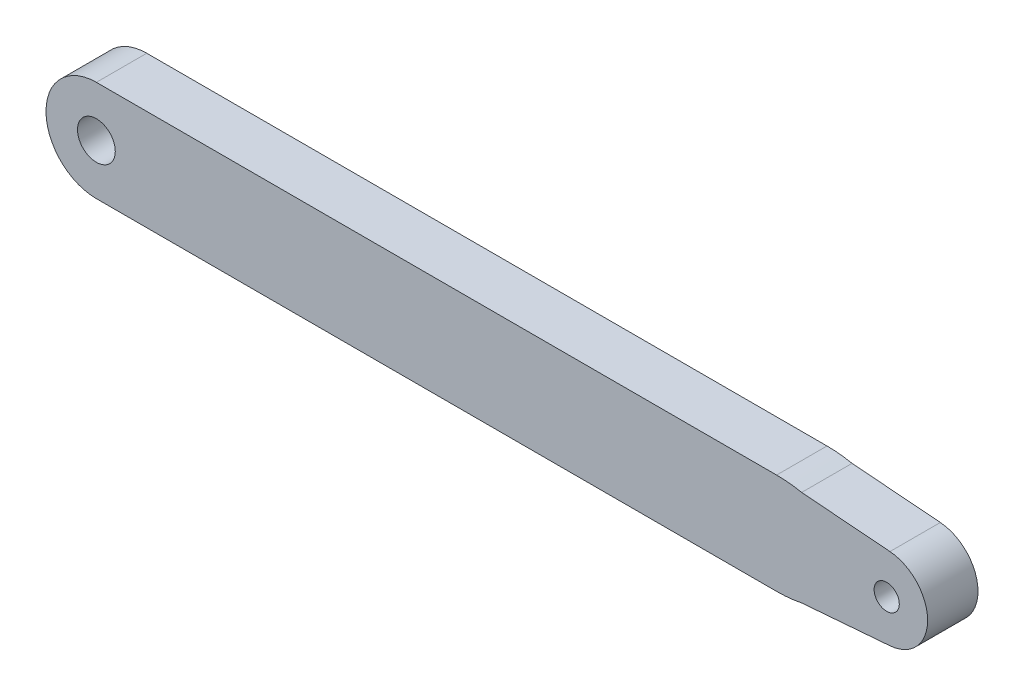
ISO-10303-21;
HEADER;
FILE_DESCRIPTION(('STEP AP214'),'2;1');
FILE_NAME('part.step','',(''),(''),'','','');
FILE_SCHEMA(('AUTOMOTIVE_DESIGN { 1 0 10303 214 1 1 1 1 }'));
ENDSEC;
DATA;
#1=APPLICATION_CONTEXT('core data for automotive mechanical design processes');
#2=APPLICATION_PROTOCOL_DEFINITION('international standard','automotive_design',2000,#1);
#3=PRODUCT_CONTEXT('',#1,'mechanical');
#4=PRODUCT('Part','Part','',(#3));
#5=PRODUCT_RELATED_PRODUCT_CATEGORY('part','',(#4));
#6=PRODUCT_DEFINITION_FORMATION('','',#4);
#7=PRODUCT_DEFINITION_CONTEXT('part definition',#1,'design');
#8=PRODUCT_DEFINITION('design','',#6,#7);
#9=PRODUCT_DEFINITION_SHAPE('','',#8);
#10=(LENGTH_UNIT() NAMED_UNIT(*) SI_UNIT(.MILLI.,.METRE.));
#11=(NAMED_UNIT(*) PLANE_ANGLE_UNIT() SI_UNIT($,.RADIAN.));
#12=(NAMED_UNIT(*) SI_UNIT($,.STERADIAN.) SOLID_ANGLE_UNIT());
#13=UNCERTAINTY_MEASURE_WITH_UNIT(LENGTH_MEASURE(1.E-05),#10,'distance_accuracy_value','');
#14=(GEOMETRIC_REPRESENTATION_CONTEXT(3) GLOBAL_UNCERTAINTY_ASSIGNED_CONTEXT((#13)) GLOBAL_UNIT_ASSIGNED_CONTEXT((#10,
#11,#12)) REPRESENTATION_CONTEXT('',''));
#15=CARTESIAN_POINT('',(0.,0.,0.));
#16=DIRECTION('',(0.,0.,1.));
#17=DIRECTION('',(1.,0.,0.));
#18=AXIS2_PLACEMENT_3D('',#15,#16,#17);
#19=CARTESIAN_POINT('',(-155.,0.,0.));
#20=DIRECTION('',(0.,0.,-1.));
#21=DIRECTION('',(-1.,0.,0.));
#22=AXIS2_PLACEMENT_3D('',#19,#20,#21);
#23=CYLINDRICAL_SURFACE('',#22,20.);
#24=DIRECTION('',(0.,0.,-1.));
#25=VECTOR('',#24,1.);
#26=CARTESIAN_POINT('',(-155.,20.,20.));
#27=LINE('',#26,#25);
#28=CARTESIAN_POINT('',(-155.,20.,0.));
#29=VERTEX_POINT('',#28);
#30=CARTESIAN_POINT('',(-155.,20.,20.));
#31=VERTEX_POINT('',#30);
#32=EDGE_CURVE('E189',#29,#31,#27,.F.);
#33=ORIENTED_EDGE('',*,*,#32,.F.);
#34=CARTESIAN_POINT('',(-155.,0.,0.));
#35=DIRECTION('',(0.,0.,1.));
#36=DIRECTION('',(1.,0.,0.));
#37=AXIS2_PLACEMENT_3D('',#34,#35,#36);
#38=CIRCLE('',#37,20.);
#39=CARTESIAN_POINT('',(-155.,-20.,0.));
#40=VERTEX_POINT('',#39);
#41=EDGE_CURVE('E53',#40,#29,#38,.F.);
#42=ORIENTED_EDGE('',*,*,#41,.F.);
#43=DIRECTION('',(0.,0.,-1.));
#44=VECTOR('',#43,1.);
#45=CARTESIAN_POINT('',(-155.,-20.,20.));
#46=LINE('',#45,#44);
#47=CARTESIAN_POINT('',(-155.,-20.,20.));
#48=VERTEX_POINT('',#47);
#49=EDGE_CURVE('E193',#48,#40,#46,.T.);
#50=ORIENTED_EDGE('',*,*,#49,.F.);
#51=CARTESIAN_POINT('',(-155.,0.,20.));
#52=DIRECTION('',(0.,0.,1.));
#53=DIRECTION('',(1.,0.,0.));
#54=AXIS2_PLACEMENT_3D('',#51,#52,#53);
#55=CIRCLE('',#54,20.);
#56=EDGE_CURVE('E12',#31,#48,#55,.T.);
#57=ORIENTED_EDGE('',*,*,#56,.F.);
#58=EDGE_LOOP('',(#33,#42,#50,#57));
#59=FACE_BOUND('',#58,.T.);
#60=ADVANCED_FACE('F44',(#59),#23,.T.);
#61=CARTESIAN_POINT('',(158.752076555219,0.,20.));
#62=DIRECTION('',(0.,0.,1.));
#63=DIRECTION('',(1.,0.,0.));
#64=AXIS2_PLACEMENT_3D('',#61,#62,#63);
#65=CYLINDRICAL_SURFACE('',#64,16.2479234447813);
#66=DIRECTION('',(0.,0.,1.));
#67=VECTOR('',#66,1.);
#68=CARTESIAN_POINT('',(160.047770821958,16.1961783342433,0.));
#69=LINE('',#68,#67);
#70=CARTESIAN_POINT('',(160.047770821958,16.1961783342433,20.));
#71=VERTEX_POINT('',#70);
#72=CARTESIAN_POINT('',(160.047770821958,16.1961783342433,0.));
#73=VERTEX_POINT('',#72);
#74=EDGE_CURVE('E177',#71,#73,#69,.F.);
#75=ORIENTED_EDGE('',*,*,#74,.F.);
#76=CARTESIAN_POINT('',(158.752076555219,0.,20.));
#77=DIRECTION('',(0.,0.,1.));
#78=DIRECTION('',(1.,0.,0.));
#79=AXIS2_PLACEMENT_3D('',#76,#77,#78);
#80=CIRCLE('',#79,16.2479234447813);
#81=CARTESIAN_POINT('',(160.047770821958,-16.1961783342433,20.));
#82=VERTEX_POINT('',#81);
#83=EDGE_CURVE('E183',#82,#71,#80,.T.);
#84=ORIENTED_EDGE('',*,*,#83,.F.);
#85=DIRECTION('',(0.,0.,-1.));
#86=VECTOR('',#85,1.);
#87=CARTESIAN_POINT('',(160.047770821958,-16.1961783342433,20.));
#88=LINE('',#87,#86);
#89=CARTESIAN_POINT('',(160.047770821958,-16.1961783342433,0.));
#90=VERTEX_POINT('',#89);
#91=EDGE_CURVE('E127',#90,#82,#88,.F.);
#92=ORIENTED_EDGE('',*,*,#91,.F.);
#93=CARTESIAN_POINT('',(158.752076555219,0.,0.));
#94=DIRECTION('',(0.,0.,1.));
#95=DIRECTION('',(1.,0.,0.));
#96=AXIS2_PLACEMENT_3D('',#93,#94,#95);
#97=CIRCLE('',#96,16.2479234447813);
#98=EDGE_CURVE('E186',#73,#90,#97,.F.);
#99=ORIENTED_EDGE('',*,*,#98,.F.);
#100=EDGE_LOOP('',(#75,#84,#92,#99));
#101=FACE_BOUND('',#100,.T.);
#102=ADVANCED_FACE('F214',(#101),#65,.T.);
#103=CARTESIAN_POINT('',(-175.,-20.,20.));
#104=DIRECTION('',(0.,1.,0.));
#105=DIRECTION('',(0.,0.,1.));
#106=AXIS2_PLACEMENT_3D('',#103,#104,#105);
#107=PLANE('',#106);
#108=DIRECTION('',(1.,0.,0.));
#109=VECTOR('',#108,1.);
#110=CARTESIAN_POINT('',(-175.,-20.,20.));
#111=LINE('',#110,#109);
#112=CARTESIAN_POINT('',(115.050125628934,-20.,20.));
#113=VERTEX_POINT('',#112);
#114=EDGE_CURVE('E111',#48,#113,#111,.T.);
#115=ORIENTED_EDGE('',*,*,#114,.F.);
#116=ORIENTED_EDGE('',*,*,#49,.T.);
#117=DIRECTION('',(1.,0.,0.));
#118=VECTOR('',#117,1.);
#119=CARTESIAN_POINT('',(-175.,-20.,0.));
#120=LINE('',#119,#118);
#121=CARTESIAN_POINT('',(115.050125628934,-20.,0.));
#122=VERTEX_POINT('',#121);
#123=EDGE_CURVE('E156',#40,#122,#120,.T.);
#124=ORIENTED_EDGE('',*,*,#123,.T.);
#125=DIRECTION('',(0.,0.,-1.));
#126=VECTOR('',#125,1.);
#127=CARTESIAN_POINT('',(115.050125628934,-20.,20.));
#128=LINE('',#127,#126);
#129=EDGE_CURVE('E118',#122,#113,#128,.F.);
#130=ORIENTED_EDGE('',*,*,#129,.T.);
#131=EDGE_LOOP('',(#115,#116,#124,#130));
#132=FACE_BOUND('',#131,.T.);
#133=ADVANCED_FACE('F216',(#132),#107,.F.);
#134=CARTESIAN_POINT('',(0.,0.,20.));
#135=DIRECTION('',(0.,0.,1.));
#136=DIRECTION('',(1.,0.,0.));
#137=AXIS2_PLACEMENT_3D('',#134,#135,#136);
#138=PLANE('',#137);
#139=CARTESIAN_POINT('',(-155.,0.,20.));
#140=DIRECTION('',(0.,0.,1.));
#141=DIRECTION('',(1.,0.,0.));
#142=AXIS2_PLACEMENT_3D('',#139,#140,#141);
#143=CIRCLE('',#142,7.50000000000001);
#144=CARTESIAN_POINT('',(-147.5,0.,20.));
#145=VERTEX_POINT('',#144);
#146=EDGE_CURVE('E301',#145,#145,#143,.T.);
#147=ORIENTED_EDGE('',*,*,#146,.F.);
#148=EDGE_LOOP('',(#147));
#149=FACE_BOUND('',#148,.T.);
#150=CARTESIAN_POINT('',(158.752076555219,0.,20.));
#151=DIRECTION('',(0.,0.,1.));
#152=DIRECTION('',(1.,0.,0.));
#153=AXIS2_PLACEMENT_3D('',#150,#151,#152);
#154=CIRCLE('',#153,4.99999999999999);
#155=CARTESIAN_POINT('',(163.752076555219,0.,20.));
#156=VERTEX_POINT('',#155);
#157=EDGE_CURVE('E302',#156,#156,#154,.T.);
#158=ORIENTED_EDGE('',*,*,#157,.F.);
#159=EDGE_LOOP('',(#158));
#160=FACE_BOUND('',#159,.T.);
#161=DIRECTION('',(-1.,0.,0.));
#162=VECTOR('',#161,1.);
#163=CARTESIAN_POINT('',(-175.,20.,20.));
#164=LINE('',#163,#162);
#165=CARTESIAN_POINT('',(115.050125628934,20.,20.));
#166=VERTEX_POINT('',#165);
#167=EDGE_CURVE('E153',#166,#31,#164,.T.);
#168=ORIENTED_EDGE('',*,*,#167,.T.);
#169=ORIENTED_EDGE('',*,*,#56,.T.);
#170=ORIENTED_EDGE('',*,*,#114,.T.);
#171=CARTESIAN_POINT('',(115.050125628934,30.,20.));
#172=DIRECTION('',(0.,0.,1.));
#173=DIRECTION('',(1.,0.,0.));
#174=AXIS2_PLACEMENT_3D('',#171,#172,#173);
#175=CIRCLE('',#174,50.);
#176=CARTESIAN_POINT('',(125.,-19.,20.));
#177=VERTEX_POINT('',#176);
#178=EDGE_CURVE('E106',#113,#177,#175,.T.);
#179=ORIENTED_EDGE('',*,*,#178,.T.);
#180=DIRECTION('',(0.996815278536125,0.07974522228289,0.));
#181=VECTOR('',#180,1.);
#182=CARTESIAN_POINT('',(175.,-15.,20.));
#183=LINE('',#182,#181);
#184=EDGE_CURVE('E109',#177,#82,#183,.T.);
#185=ORIENTED_EDGE('',*,*,#184,.T.);
#186=ORIENTED_EDGE('',*,*,#83,.T.);
#187=DIRECTION('',(0.996815278536125,-0.07974522228289,0.));
#188=VECTOR('',#187,1.);
#189=CARTESIAN_POINT('',(175.,15.,20.));
#190=LINE('',#189,#188);
#191=CARTESIAN_POINT('',(125.,19.,20.));
#192=VERTEX_POINT('',#191);
#193=EDGE_CURVE('E136',#192,#71,#190,.T.);
#194=ORIENTED_EDGE('',*,*,#193,.F.);
#195=CARTESIAN_POINT('',(115.050125628934,-30.,20.));
#196=DIRECTION('',(0.,0.,1.));
#197=DIRECTION('',(1.,0.,0.));
#198=AXIS2_PLACEMENT_3D('',#195,#196,#197);
#199=CIRCLE('',#198,50.);
#200=EDGE_CURVE('E159',#192,#166,#199,.T.);
#201=ORIENTED_EDGE('',*,*,#200,.T.);
#202=EDGE_LOOP('',(#168,#169,#170,#179,#185,#186,#194,#201));
#203=FACE_BOUND('',#202,.T.);
#204=ADVANCED_FACE('F108',(#149,#160,#203),#138,.T.);
#205=CARTESIAN_POINT('',(0.,0.,0.));
#206=DIRECTION('',(0.,0.,1.));
#207=DIRECTION('',(1.,0.,0.));
#208=AXIS2_PLACEMENT_3D('',#205,#206,#207);
#209=PLANE('',#208);
#210=CARTESIAN_POINT('',(-155.,0.,0.));
#211=DIRECTION('',(0.,0.,1.));
#212=DIRECTION('',(1.,0.,0.));
#213=AXIS2_PLACEMENT_3D('',#210,#211,#212);
#214=CIRCLE('',#213,7.50000000000001);
#215=CARTESIAN_POINT('',(-147.5,0.,0.));
#216=VERTEX_POINT('',#215);
#217=EDGE_CURVE('E130',#216,#216,#214,.T.);
#218=ORIENTED_EDGE('',*,*,#217,.T.);
#219=EDGE_LOOP('',(#218));
#220=FACE_BOUND('',#219,.T.);
#221=CARTESIAN_POINT('',(158.752076555219,0.,0.));
#222=DIRECTION('',(0.,0.,1.));
#223=DIRECTION('',(1.,0.,0.));
#224=AXIS2_PLACEMENT_3D('',#221,#222,#223);
#225=CIRCLE('',#224,4.99999999999999);
#226=CARTESIAN_POINT('',(163.752076555219,0.,0.));
#227=VERTEX_POINT('',#226);
#228=EDGE_CURVE('E299',#227,#227,#225,.T.);
#229=ORIENTED_EDGE('',*,*,#228,.T.);
#230=EDGE_LOOP('',(#229));
#231=FACE_BOUND('',#230,.T.);
#232=ORIENTED_EDGE('',*,*,#123,.F.);
#233=ORIENTED_EDGE('',*,*,#41,.T.);
#234=DIRECTION('',(-1.,0.,0.));
#235=VECTOR('',#234,1.);
#236=CARTESIAN_POINT('',(-175.,20.,0.));
#237=LINE('',#236,#235);
#238=CARTESIAN_POINT('',(115.050125628934,20.,0.));
#239=VERTEX_POINT('',#238);
#240=EDGE_CURVE('E152',#239,#29,#237,.T.);
#241=ORIENTED_EDGE('',*,*,#240,.F.);
#242=CARTESIAN_POINT('',(115.050125628934,-30.,0.));
#243=DIRECTION('',(0.,0.,1.));
#244=DIRECTION('',(1.,0.,0.));
#245=AXIS2_PLACEMENT_3D('',#242,#243,#244);
#246=CIRCLE('',#245,50.);
#247=CARTESIAN_POINT('',(125.,19.,0.));
#248=VERTEX_POINT('',#247);
#249=EDGE_CURVE('E170',#239,#248,#246,.F.);
#250=ORIENTED_EDGE('',*,*,#249,.T.);
#251=DIRECTION('',(0.996815278536125,-0.07974522228289,0.));
#252=VECTOR('',#251,1.);
#253=CARTESIAN_POINT('',(175.,15.,0.));
#254=LINE('',#253,#252);
#255=EDGE_CURVE('E141',#248,#73,#254,.T.);
#256=ORIENTED_EDGE('',*,*,#255,.T.);
#257=ORIENTED_EDGE('',*,*,#98,.T.);
#258=DIRECTION('',(0.996815278536125,0.07974522228289,0.));
#259=VECTOR('',#258,1.);
#260=CARTESIAN_POINT('',(175.,-15.,0.));
#261=LINE('',#260,#259);
#262=CARTESIAN_POINT('',(125.,-19.,0.));
#263=VERTEX_POINT('',#262);
#264=EDGE_CURVE('E129',#263,#90,#261,.T.);
#265=ORIENTED_EDGE('',*,*,#264,.F.);
#266=CARTESIAN_POINT('',(115.050125628934,30.,0.));
#267=DIRECTION('',(0.,0.,1.));
#268=DIRECTION('',(1.,0.,0.));
#269=AXIS2_PLACEMENT_3D('',#266,#267,#268);
#270=CIRCLE('',#269,50.);
#271=EDGE_CURVE('E117',#263,#122,#270,.F.);
#272=ORIENTED_EDGE('',*,*,#271,.T.);
#273=EDGE_LOOP('',(#232,#233,#241,#250,#256,#257,#265,#272));
#274=FACE_BOUND('',#273,.T.);
#275=ADVANCED_FACE('F199',(#220,#231,#274),#209,.F.);
#276=CARTESIAN_POINT('',(-175.,20.,20.));
#277=DIRECTION('',(0.,-1.,0.));
#278=DIRECTION('',(0.,0.,-1.));
#279=AXIS2_PLACEMENT_3D('',#276,#277,#278);
#280=PLANE('',#279);
#281=ORIENTED_EDGE('',*,*,#240,.T.);
#282=ORIENTED_EDGE('',*,*,#32,.T.);
#283=ORIENTED_EDGE('',*,*,#167,.F.);
#284=DIRECTION('',(0.,0.,1.));
#285=VECTOR('',#284,1.);
#286=CARTESIAN_POINT('',(115.050125628934,20.,20.));
#287=LINE('',#286,#285);
#288=EDGE_CURVE('E167',#166,#239,#287,.F.);
#289=ORIENTED_EDGE('',*,*,#288,.T.);
#290=EDGE_LOOP('',(#281,#282,#283,#289));
#291=FACE_BOUND('',#290,.T.);
#292=ADVANCED_FACE('F203',(#291),#280,.F.);
#293=CARTESIAN_POINT('',(175.,15.,0.));
#294=DIRECTION('',(-0.07974522228289,-0.996815278536125,0.));
#295=DIRECTION('',(0.996815278536125,-0.07974522228289,0.));
#296=AXIS2_PLACEMENT_3D('',#293,#294,#295);
#297=PLANE('',#296);
#298=ORIENTED_EDGE('',*,*,#193,.T.);
#299=ORIENTED_EDGE('',*,*,#74,.T.);
#300=ORIENTED_EDGE('',*,*,#255,.F.);
#301=DIRECTION('',(0.,0.,1.));
#302=VECTOR('',#301,1.);
#303=CARTESIAN_POINT('',(125.,19.,0.));
#304=LINE('',#303,#302);
#305=EDGE_CURVE('E147',#248,#192,#304,.T.);
#306=ORIENTED_EDGE('',*,*,#305,.T.);
#307=EDGE_LOOP('',(#298,#299,#300,#306));
#308=FACE_BOUND('',#307,.T.);
#309=ADVANCED_FACE('F210',(#308),#297,.F.);
#310=CARTESIAN_POINT('',(115.050125628934,-30.,0.));
#311=DIRECTION('',(0.,0.,1.));
#312=DIRECTION('',(1.,0.,0.));
#313=AXIS2_PLACEMENT_3D('',#310,#311,#312);
#314=CYLINDRICAL_SURFACE('',#313,50.);
#315=ORIENTED_EDGE('',*,*,#249,.F.);
#316=ORIENTED_EDGE('',*,*,#288,.F.);
#317=ORIENTED_EDGE('',*,*,#200,.F.);
#318=ORIENTED_EDGE('',*,*,#305,.F.);
#319=EDGE_LOOP('',(#315,#316,#317,#318));
#320=FACE_BOUND('',#319,.T.);
#321=ADVANCED_FACE('F206',(#320),#314,.T.);
#322=CARTESIAN_POINT('',(175.,-15.,0.));
#323=DIRECTION('',(0.07974522228289,-0.996815278536125,0.));
#324=DIRECTION('',(0.996815278536125,0.07974522228289,0.));
#325=AXIS2_PLACEMENT_3D('',#322,#323,#324);
#326=PLANE('',#325);
#327=ORIENTED_EDGE('',*,*,#264,.T.);
#328=ORIENTED_EDGE('',*,*,#91,.T.);
#329=ORIENTED_EDGE('',*,*,#184,.F.);
#330=DIRECTION('',(0.,0.,1.));
#331=VECTOR('',#330,1.);
#332=CARTESIAN_POINT('',(125.,-19.,0.));
#333=LINE('',#332,#331);
#334=EDGE_CURVE('E124',#263,#177,#333,.T.);
#335=ORIENTED_EDGE('',*,*,#334,.F.);
#336=EDGE_LOOP('',(#327,#328,#329,#335));
#337=FACE_BOUND('',#336,.T.);
#338=ADVANCED_FACE('F123',(#337),#326,.T.);
#339=CARTESIAN_POINT('',(115.050125628934,30.,0.));
#340=DIRECTION('',(0.,0.,-1.));
#341=DIRECTION('',(-1.,0.,0.));
#342=AXIS2_PLACEMENT_3D('',#339,#340,#341);
#343=CYLINDRICAL_SURFACE('',#342,50.);
#344=ORIENTED_EDGE('',*,*,#271,.F.);
#345=ORIENTED_EDGE('',*,*,#334,.T.);
#346=ORIENTED_EDGE('',*,*,#178,.F.);
#347=ORIENTED_EDGE('',*,*,#129,.F.);
#348=EDGE_LOOP('',(#344,#345,#346,#347));
#349=FACE_BOUND('',#348,.T.);
#350=ADVANCED_FACE('F133',(#349),#343,.T.);
#351=CARTESIAN_POINT('',(158.752076555219,0.,0.));
#352=DIRECTION('',(0.,0.,1.));
#353=DIRECTION('',(1.,0.,0.));
#354=AXIS2_PLACEMENT_3D('',#351,#352,#353);
#355=CYLINDRICAL_SURFACE('',#354,4.99999999999999);
#356=ORIENTED_EDGE('',*,*,#228,.F.);
#357=EDGE_LOOP('',(#356));
#358=FACE_BOUND('',#357,.T.);
#359=ORIENTED_EDGE('',*,*,#157,.T.);
#360=EDGE_LOOP('',(#359));
#361=FACE_BOUND('',#360,.T.);
#362=ADVANCED_FACE('F267',(#358,#361),#355,.F.);
#363=CARTESIAN_POINT('',(-155.,0.,0.));
#364=DIRECTION('',(0.,0.,1.));
#365=DIRECTION('',(1.,0.,0.));
#366=AXIS2_PLACEMENT_3D('',#363,#364,#365);
#367=CYLINDRICAL_SURFACE('',#366,7.50000000000001);
#368=ORIENTED_EDGE('',*,*,#217,.F.);
#369=EDGE_LOOP('',(#368));
#370=FACE_BOUND('',#369,.T.);
#371=ORIENTED_EDGE('',*,*,#146,.T.);
#372=EDGE_LOOP('',(#371));
#373=FACE_BOUND('',#372,.T.);
#374=ADVANCED_FACE('F272',(#370,#373),#367,.F.);
#375=CLOSED_SHELL('',(#60,#102,#133,#204,#275,#292,#309,#321,#338,#350,#362,#374));
#376=MANIFOLD_SOLID_BREP('B2',#375);
#377=ADVANCED_BREP_SHAPE_REPRESENTATION('',(#18,#376),#14);
#378=SHAPE_DEFINITION_REPRESENTATION(#9,#377);
ENDSEC;
END-ISO-10303-21;
